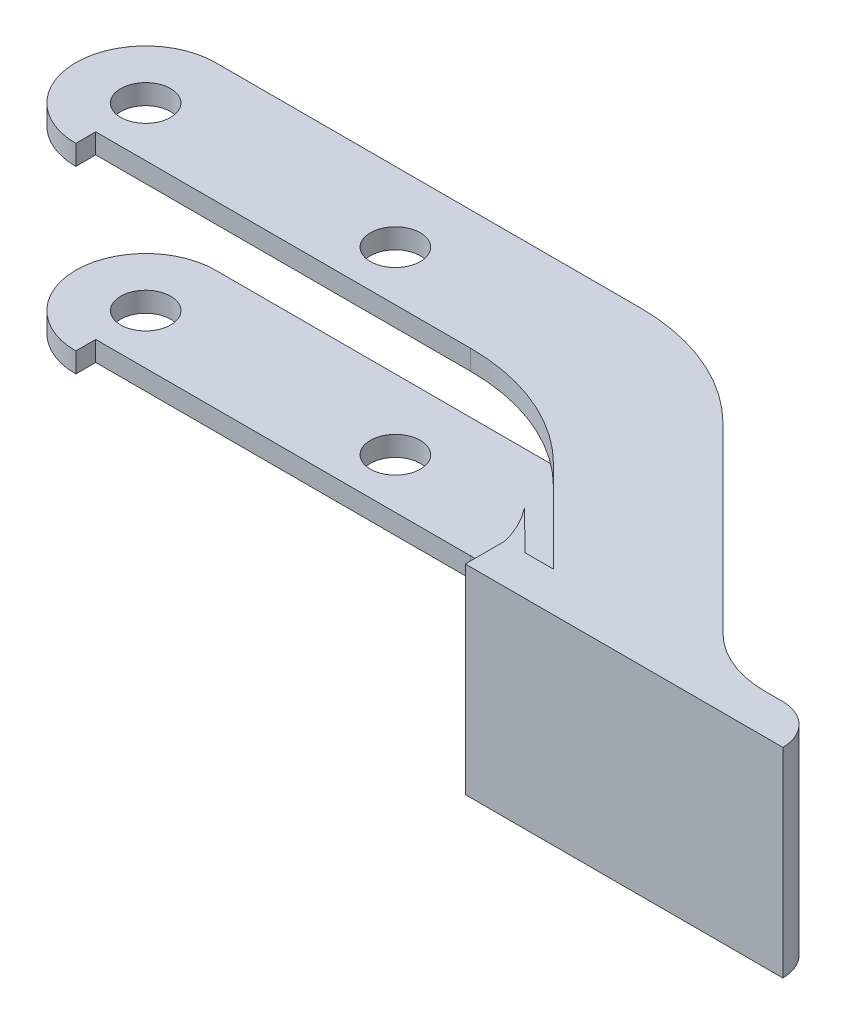
ISO-10303-21;
HEADER;
FILE_DESCRIPTION(('STEP AP214'),'2;1');
FILE_NAME('part.step','',(''),(''),'','','');
FILE_SCHEMA(('AUTOMOTIVE_DESIGN { 1 0 10303 214 1 1 1 1 }'));
ENDSEC;
DATA;
#1=APPLICATION_CONTEXT('core data for automotive mechanical design processes');
#2=APPLICATION_PROTOCOL_DEFINITION('international standard','automotive_design',2000,#1);
#3=PRODUCT_CONTEXT('',#1,'mechanical');
#4=PRODUCT('Part','Part','',(#3));
#5=PRODUCT_RELATED_PRODUCT_CATEGORY('part','',(#4));
#6=PRODUCT_DEFINITION_FORMATION('','',#4);
#7=PRODUCT_DEFINITION_CONTEXT('part definition',#1,'design');
#8=PRODUCT_DEFINITION('design','',#6,#7);
#9=PRODUCT_DEFINITION_SHAPE('','',#8);
#10=(LENGTH_UNIT() NAMED_UNIT(*) SI_UNIT(.MILLI.,.METRE.));
#11=(NAMED_UNIT(*) PLANE_ANGLE_UNIT() SI_UNIT($,.RADIAN.));
#12=(NAMED_UNIT(*) SI_UNIT($,.STERADIAN.) SOLID_ANGLE_UNIT());
#13=UNCERTAINTY_MEASURE_WITH_UNIT(LENGTH_MEASURE(1.E-05),#10,'distance_accuracy_value','');
#14=(GEOMETRIC_REPRESENTATION_CONTEXT(3) GLOBAL_UNCERTAINTY_ASSIGNED_CONTEXT((#13)) GLOBAL_UNIT_ASSIGNED_CONTEXT((#10,
#11,#12)) REPRESENTATION_CONTEXT('',''));
#15=CARTESIAN_POINT('',(0.,0.,0.));
#16=DIRECTION('',(0.,0.,1.));
#17=DIRECTION('',(1.,0.,0.));
#18=AXIS2_PLACEMENT_3D('',#15,#16,#17);
#19=CARTESIAN_POINT('',(0.,2.,0.));
#20=DIRECTION('',(0.,1.,0.));
#21=DIRECTION('',(0.,0.,1.));
#22=AXIS2_PLACEMENT_3D('',#19,#20,#21);
#23=PLANE('',#22);
#24=DIRECTION('',(0.715134595588796,0.,0.698986773975052));
#25=VECTOR('',#24,1.);
#26=CARTESIAN_POINT('',(18.3403479364555,2.,-18.7640421719382));
#27=LINE('',#26,#25);
#28=CARTESIAN_POINT('',(54.0801942687536,2.,16.1687943098556));
#29=VERTEX_POINT('',#28);
#30=CARTESIAN_POINT('',(58.0040024503266,2.,20.0040024503266));
#31=VERTEX_POINT('',#30);
#32=EDGE_CURVE('E293',#29,#31,#27,.T.);
#33=ORIENTED_EDGE('',*,*,#32,.F.);
#34=CARTESIAN_POINT('',(46.2631515841613,2.,22.4052872078923));
#35=DIRECTION('',(0.,1.,0.));
#36=DIRECTION('',(0.,0.,1.));
#37=AXIS2_PLACEMENT_3D('',#34,#35,#36);
#38=CIRCLE('',#37,10.);
#39=CARTESIAN_POINT('',(55.9705627484771,2.,20.0040024503266));
#40=VERTEX_POINT('',#39);
#41=EDGE_CURVE('E427',#29,#40,#38,.F.);
#42=ORIENTED_EDGE('',*,*,#41,.T.);
#43=DIRECTION('',(-1.,0.,0.));
#44=VECTOR('',#43,1.);
#45=CARTESIAN_POINT('',(0.,2.,20.0040024503266));
#46=LINE('',#45,#44);
#47=EDGE_CURVE('E363',#31,#40,#46,.T.);
#48=ORIENTED_EDGE('',*,*,#47,.F.);
#49=EDGE_LOOP('',(#33,#42,#48));
#50=FACE_BOUND('',#49,.T.);
#51=ADVANCED_FACE('F32',(#50),#23,.T.);
#52=CARTESIAN_POINT('',(25.,18.,0.));
#53=DIRECTION('',(0.,1.,0.));
#54=DIRECTION('',(0.,0.,-1.));
#55=AXIS2_PLACEMENT_3D('',#52,#53,#54);
#56=PLANE('',#55);
#57=CARTESIAN_POINT('',(46.2631515841613,18.,22.4052872078923));
#58=DIRECTION('',(0.,1.,0.));
#59=DIRECTION('',(0.,0.,1.));
#60=AXIS2_PLACEMENT_3D('',#57,#58,#59);
#61=CIRCLE('',#60,10.);
#62=CARTESIAN_POINT('',(55.9705627484771,18.,20.0040024503266));
#63=VERTEX_POINT('',#62);
#64=CARTESIAN_POINT('',(54.0801942687536,18.,16.1687943098556));
#65=VERTEX_POINT('',#64);
#66=EDGE_CURVE('E430',#63,#65,#61,.T.);
#67=ORIENTED_EDGE('',*,*,#66,.T.);
#68=DIRECTION('',(0.715134595588796,0.,0.698986773975052));
#69=VECTOR('',#68,1.);
#70=CARTESIAN_POINT('',(31.1257851816543,18.,-6.26730157372408));
#71=LINE('',#70,#69);
#72=CARTESIAN_POINT('',(58.0040024503266,18.,20.0040024503266));
#73=VERTEX_POINT('',#72);
#74=EDGE_CURVE('E55',#65,#73,#71,.T.);
#75=ORIENTED_EDGE('',*,*,#74,.T.);
#76=DIRECTION('',(1.,0.,0.));
#77=VECTOR('',#76,1.);
#78=CARTESIAN_POINT('',(55.9705627484771,18.,20.0040024503266));
#79=LINE('',#78,#77);
#80=EDGE_CURVE('E421',#63,#73,#79,.T.);
#81=ORIENTED_EDGE('',*,*,#80,.F.);
#82=EDGE_LOOP('',(#67,#75,#81));
#83=FACE_BOUND('',#82,.T.);
#84=ADVANCED_FACE('F487',(#83),#56,.F.);
#85=CARTESIAN_POINT('',(55.9705627484771,0.,20.0040024503266));
#86=DIRECTION('',(0.,0.,-1.));
#87=DIRECTION('',(-1.,0.,0.));
#88=AXIS2_PLACEMENT_3D('',#85,#86,#87);
#89=PLANE('',#88);
#90=CARTESIAN_POINT('',(81.9451279472808,2.,20.0040024503266));
#91=VERTEX_POINT('',#90);
#92=CARTESIAN_POINT('',(60.8324295750727,2.,20.0040024503266));
#93=VERTEX_POINT('',#92);
#94=EDGE_CURVE('E370',#91,#93,#46,.T.);
#95=ORIENTED_EDGE('',*,*,#94,.T.);
#96=DIRECTION('',(0.,-1.,0.));
#97=VECTOR('',#96,1.);
#98=CARTESIAN_POINT('',(60.8324295750727,20.,20.0040024503266));
#99=LINE('',#98,#97);
#100=CARTESIAN_POINT('',(60.8324295750727,0.,20.0040024503266));
#101=VERTEX_POINT('',#100);
#102=EDGE_CURVE('E284',#93,#101,#99,.T.);
#103=ORIENTED_EDGE('',*,*,#102,.T.);
#104=DIRECTION('',(-1.,0.,0.));
#105=VECTOR('',#104,1.);
#106=CARTESIAN_POINT('',(58.0040024503266,0.,20.0040024503266));
#107=LINE('',#106,#105);
#108=CARTESIAN_POINT('',(58.0040024503266,0.,20.0040024503266));
#109=VERTEX_POINT('',#108);
#110=EDGE_CURVE('E251',#101,#109,#107,.T.);
#111=ORIENTED_EDGE('',*,*,#110,.T.);
#112=DIRECTION('',(0.,-1.,0.));
#113=VECTOR('',#112,1.);
#114=CARTESIAN_POINT('',(58.0040024503266,20.,20.0040024503266));
#115=LINE('',#114,#113);
#116=EDGE_CURVE('E280',#31,#109,#115,.T.);
#117=ORIENTED_EDGE('',*,*,#116,.F.);
#118=ORIENTED_EDGE('',*,*,#47,.T.);
#119=DIRECTION('',(0.,1.,0.));
#120=VECTOR('',#119,1.);
#121=CARTESIAN_POINT('',(55.9705627484771,0.,20.0040024503266));
#122=LINE('',#121,#120);
#123=EDGE_CURVE('E364',#40,#63,#122,.T.);
#124=ORIENTED_EDGE('',*,*,#123,.T.);
#125=ORIENTED_EDGE('',*,*,#80,.T.);
#126=CARTESIAN_POINT('',(58.0040024503266,20.,20.0040024503266));
#127=VERTEX_POINT('',#126);
#128=EDGE_CURVE('E278',#127,#73,#115,.T.);
#129=ORIENTED_EDGE('',*,*,#128,.F.);
#130=DIRECTION('',(-1.,0.,0.));
#131=VECTOR('',#130,1.);
#132=CARTESIAN_POINT('',(58.0040024503266,20.,20.0040024503266));
#133=LINE('',#132,#131);
#134=CARTESIAN_POINT('',(60.8324295750727,20.,20.0040024503266));
#135=VERTEX_POINT('',#134);
#136=EDGE_CURVE('E258',#135,#127,#133,.T.);
#137=ORIENTED_EDGE('',*,*,#136,.F.);
#138=CARTESIAN_POINT('',(60.8324295750727,18.,20.0040024503266));
#139=VERTEX_POINT('',#138);
#140=EDGE_CURVE('E281',#135,#139,#99,.T.);
#141=ORIENTED_EDGE('',*,*,#140,.T.);
#142=CARTESIAN_POINT('',(81.9451279472808,18.,20.0040024503266));
#143=VERTEX_POINT('',#142);
#144=EDGE_CURVE('E420',#139,#143,#79,.T.);
#145=ORIENTED_EDGE('',*,*,#144,.T.);
#146=DIRECTION('',(0.,1.,0.));
#147=VECTOR('',#146,1.);
#148=CARTESIAN_POINT('',(81.9451279472808,0.,20.0040024503266));
#149=LINE('',#148,#147);
#150=CARTESIAN_POINT('',(81.9451279472808,20.,20.0040024503266));
#151=VERTEX_POINT('',#150);
#152=EDGE_CURVE('E438',#143,#151,#149,.T.);
#153=ORIENTED_EDGE('',*,*,#152,.T.);
#154=DIRECTION('',(-1.,0.,0.));
#155=VECTOR('',#154,1.);
#156=CARTESIAN_POINT('',(55.9705627484771,20.,20.0040024503266));
#157=LINE('',#156,#155);
#158=CARTESIAN_POINT('',(83.76969240085,20.,20.0040024503266));
#159=VERTEX_POINT('',#158);
#160=EDGE_CURVE('E352',#159,#151,#157,.T.);
#161=ORIENTED_EDGE('',*,*,#160,.F.);
#162=DIRECTION('',(0.,1.,0.));
#163=VECTOR('',#162,1.);
#164=CARTESIAN_POINT('',(83.76969240085,0.,20.0040024503266));
#165=LINE('',#164,#163);
#166=CARTESIAN_POINT('',(83.76969240085,0.,20.0040024503266));
#167=VERTEX_POINT('',#166);
#168=EDGE_CURVE('E457',#159,#167,#165,.F.);
#169=ORIENTED_EDGE('',*,*,#168,.T.);
#170=DIRECTION('',(-1.,0.,0.));
#171=VECTOR('',#170,1.);
#172=CARTESIAN_POINT('',(55.9705627484771,0.,20.0040024503266));
#173=LINE('',#172,#171);
#174=CARTESIAN_POINT('',(81.9451279472808,0.,20.0040024503266));
#175=VERTEX_POINT('',#174);
#176=EDGE_CURVE('E357',#167,#175,#173,.T.);
#177=ORIENTED_EDGE('',*,*,#176,.T.);
#178=DIRECTION('',(0.,1.,0.));
#179=VECTOR('',#178,1.);
#180=CARTESIAN_POINT('',(81.9451279472808,2.,20.0040024503266));
#181=LINE('',#180,#179);
#182=EDGE_CURVE('E435',#175,#91,#181,.T.);
#183=ORIENTED_EDGE('',*,*,#182,.T.);
#184=EDGE_LOOP('',(#95,#103,#111,#117,#118,#124,#125,#129,#137,#141,#145,#153,#161,#169,#177,#183));
#185=FACE_BOUND('',#184,.T.);
#186=ADVANCED_FACE('F478',(#185),#89,.T.);
#187=DIRECTION('',(0.,0.,1.));
#188=VECTOR('',#187,1.);
#189=CARTESIAN_POINT('',(0.,2.,0.));
#190=LINE('',#189,#188);
#191=CARTESIAN_POINT('',(0.,2.,5.));
#192=VERTEX_POINT('',#191);
#193=CARTESIAN_POINT('',(0.,2.,7.));
#194=VERTEX_POINT('',#193);
#195=EDGE_CURVE('E296',#192,#194,#190,.T.);
#196=ORIENTED_EDGE('',*,*,#195,.F.);
#197=DIRECTION('',(-1.,0.,0.));
#198=VECTOR('',#197,1.);
#199=CARTESIAN_POINT('',(0.,2.,4.99999999999999));
#200=LINE('',#199,#198);
#201=CARTESIAN_POINT('',(37.5441558772842,2.,4.99999999999999));
#202=VERTEX_POINT('',#201);
#203=EDGE_CURVE('E298',#202,#192,#200,.T.);
#204=ORIENTED_EDGE('',*,*,#203,.F.);
#205=CARTESIAN_POINT('',(37.5441558772843,2.,25.));
#206=DIRECTION('',(0.,1.,0.));
#207=DIRECTION('',(0.,0.,1.));
#208=AXIS2_PLACEMENT_3D('',#205,#206,#207);
#209=CIRCLE('',#208,20.);
#210=CARTESIAN_POINT('',(51.6862915010153,2.,10.8578643762691));
#211=VERTEX_POINT('',#210);
#212=EDGE_CURVE('E300',#211,#202,#209,.T.);
#213=ORIENTED_EDGE('',*,*,#212,.F.);
#214=DIRECTION('',(-0.707106781186547,0.,-0.707106781186548));
#215=VECTOR('',#214,1.);
#216=CARTESIAN_POINT('',(20.4142135623731,2.,-20.4142135623731));
#217=LINE('',#216,#215);
#218=EDGE_CURVE('E302',#93,#211,#217,.T.);
#219=ORIENTED_EDGE('',*,*,#218,.F.);
#220=ORIENTED_EDGE('',*,*,#94,.F.);
#221=CARTESIAN_POINT('',(81.9451279472808,2.,10.0040024503266));
#222=DIRECTION('',(0.,1.,0.));
#223=DIRECTION('',(0.,0.,1.));
#224=AXIS2_PLACEMENT_3D('',#221,#222,#223);
#225=CIRCLE('',#224,10.);
#226=CARTESIAN_POINT('',(74.8740601354152,2.,17.075070262192));
#227=VERTEX_POINT('',#226);
#228=EDGE_CURVE('E450',#91,#227,#225,.F.);
#229=ORIENTED_EDGE('',*,*,#228,.T.);
#230=DIRECTION('',(0.707106781186545,0.,0.70710678118655));
#231=VECTOR('',#230,1.);
#232=CARTESIAN_POINT('',(71.8700576850888,2.,14.0710678118655));
#233=LINE('',#232,#231);
#234=CARTESIAN_POINT('',(56.6568542494924,2.,-1.14213562373091));
#235=VERTEX_POINT('',#234);
#236=EDGE_CURVE('E377',#235,#227,#233,.T.);
#237=ORIENTED_EDGE('',*,*,#236,.F.);
#238=CARTESIAN_POINT('',(42.5147186257615,2.,13.));
#239=DIRECTION('',(0.,-1.,0.));
#240=DIRECTION('',(0.,0.,-1.));
#241=AXIS2_PLACEMENT_3D('',#238,#239,#240);
#242=CIRCLE('',#241,20.);
#243=CARTESIAN_POINT('',(42.5147186257614,2.,-7.));
#244=VERTEX_POINT('',#243);
#245=EDGE_CURVE('E374',#244,#235,#242,.T.);
#246=ORIENTED_EDGE('',*,*,#245,.F.);
#247=DIRECTION('',(-1.,0.,0.));
#248=VECTOR('',#247,1.);
#249=CARTESIAN_POINT('',(0.,2.,-7.));
#250=LINE('',#249,#248);
#251=CARTESIAN_POINT('',(0.,2.,-7.));
#252=VERTEX_POINT('',#251);
#253=EDGE_CURVE('E409',#244,#252,#250,.T.);
#254=ORIENTED_EDGE('',*,*,#253,.T.);
#255=CARTESIAN_POINT('',(0.,2.,0.));
#256=DIRECTION('',(0.,1.,0.));
#257=DIRECTION('',(0.,0.,1.));
#258=AXIS2_PLACEMENT_3D('',#255,#256,#257);
#259=CIRCLE('',#258,7.);
#260=EDGE_CURVE('E406',#252,#194,#259,.T.);
#261=ORIENTED_EDGE('',*,*,#260,.T.);
#262=EDGE_LOOP('',(#196,#204,#213,#219,#220,#229,#237,#246,#254,#261));
#263=FACE_BOUND('',#262,.T.);
#264=CARTESIAN_POINT('',(0.,2.,0.));
#265=DIRECTION('',(0.,1.,0.));
#266=DIRECTION('',(0.,0.,1.));
#267=AXIS2_PLACEMENT_3D('',#264,#265,#266);
#268=CIRCLE('',#267,2.5);
#269=CARTESIAN_POINT('',(0.,2.,2.5));
#270=VERTEX_POINT('',#269);
#271=EDGE_CURVE('E400',#270,#270,#268,.T.);
#272=ORIENTED_EDGE('',*,*,#271,.F.);
#273=EDGE_LOOP('',(#272));
#274=FACE_BOUND('',#273,.T.);
#275=CARTESIAN_POINT('',(25.,2.,0.));
#276=DIRECTION('',(0.,1.,0.));
#277=DIRECTION('',(0.,0.,1.));
#278=AXIS2_PLACEMENT_3D('',#275,#276,#277);
#279=CIRCLE('',#278,2.5);
#280=CARTESIAN_POINT('',(25.,2.,2.5));
#281=VERTEX_POINT('',#280);
#282=EDGE_CURVE('E394',#281,#281,#279,.T.);
#283=ORIENTED_EDGE('',*,*,#282,.F.);
#284=EDGE_LOOP('',(#283));
#285=FACE_BOUND('',#284,.T.);
#286=ADVANCED_FACE('F495',(#263,#274,#285),#23,.T.);
#287=CARTESIAN_POINT('',(0.,0.,0.));
#288=DIRECTION('',(0.,1.,0.));
#289=DIRECTION('',(0.,0.,1.));
#290=AXIS2_PLACEMENT_3D('',#287,#288,#289);
#291=PLANE('',#290);
#292=DIRECTION('',(1.,0.,0.));
#293=VECTOR('',#292,1.);
#294=CARTESIAN_POINT('',(25.,0.,4.99999999999999));
#295=LINE('',#294,#293);
#296=CARTESIAN_POINT('',(0.,0.,5.));
#297=VERTEX_POINT('',#296);
#298=CARTESIAN_POINT('',(37.5441558772842,0.,4.99999999999999));
#299=VERTEX_POINT('',#298);
#300=EDGE_CURVE('E267',#297,#299,#295,.T.);
#301=ORIENTED_EDGE('',*,*,#300,.F.);
#302=DIRECTION('',(0.,0.,-1.));
#303=VECTOR('',#302,1.);
#304=CARTESIAN_POINT('',(0.,0.,7.));
#305=LINE('',#304,#303);
#306=CARTESIAN_POINT('',(0.,0.,7.));
#307=VERTEX_POINT('',#306);
#308=EDGE_CURVE('E264',#307,#297,#305,.T.);
#309=ORIENTED_EDGE('',*,*,#308,.F.);
#310=CARTESIAN_POINT('',(0.,0.,0.));
#311=DIRECTION('',(0.,1.,0.));
#312=DIRECTION('',(0.,0.,1.));
#313=AXIS2_PLACEMENT_3D('',#310,#311,#312);
#314=CIRCLE('',#313,7.);
#315=CARTESIAN_POINT('',(0.,0.,-7.));
#316=VERTEX_POINT('',#315);
#317=EDGE_CURVE('E403',#316,#307,#314,.T.);
#318=ORIENTED_EDGE('',*,*,#317,.F.);
#319=DIRECTION('',(-1.,0.,0.));
#320=VECTOR('',#319,1.);
#321=CARTESIAN_POINT('',(0.,0.,-7.));
#322=LINE('',#321,#320);
#323=CARTESIAN_POINT('',(42.5147186257614,0.,-7.));
#324=VERTEX_POINT('',#323);
#325=EDGE_CURVE('E410',#324,#316,#322,.T.);
#326=ORIENTED_EDGE('',*,*,#325,.F.);
#327=CARTESIAN_POINT('',(42.5147186257615,0.,13.));
#328=DIRECTION('',(0.,-1.,0.));
#329=DIRECTION('',(0.,0.,-1.));
#330=AXIS2_PLACEMENT_3D('',#327,#328,#329);
#331=CIRCLE('',#330,20.);
#332=CARTESIAN_POINT('',(56.6568542494924,0.,-1.14213562373091));
#333=VERTEX_POINT('',#332);
#334=EDGE_CURVE('E373',#324,#333,#331,.T.);
#335=ORIENTED_EDGE('',*,*,#334,.T.);
#336=DIRECTION('',(0.707106781186542,0.,0.707106781186553));
#337=VECTOR('',#336,1.);
#338=CARTESIAN_POINT('',(71.8700576850888,0.,14.0710678118655));
#339=LINE('',#338,#337);
#340=CARTESIAN_POINT('',(74.8740601354152,0.,17.075070262192));
#341=VERTEX_POINT('',#340);
#342=EDGE_CURVE('E384',#333,#341,#339,.T.);
#343=ORIENTED_EDGE('',*,*,#342,.T.);
#344=CARTESIAN_POINT('',(81.9451279472808,0.,10.0040024503266));
#345=DIRECTION('',(0.,1.,0.));
#346=DIRECTION('',(0.,0.,1.));
#347=AXIS2_PLACEMENT_3D('',#344,#345,#346);
#348=CIRCLE('',#347,10.);
#349=EDGE_CURVE('E452',#341,#175,#348,.T.);
#350=ORIENTED_EDGE('',*,*,#349,.T.);
#351=ORIENTED_EDGE('',*,*,#176,.F.);
#352=CARTESIAN_POINT('',(83.76969240085,0.,24.0040024503266));
#353=DIRECTION('',(0.,1.,0.));
#354=DIRECTION('',(0.,0.,1.));
#355=AXIS2_PLACEMENT_3D('',#352,#353,#354);
#356=CIRCLE('',#355,4.);
#357=CARTESIAN_POINT('',(87.7695526217003,0.,23.9705627484772));
#358=VERTEX_POINT('',#357);
#359=EDGE_CURVE('E459',#167,#358,#356,.F.);
#360=ORIENTED_EDGE('',*,*,#359,.T.);
#361=DIRECTION('',(-1.,0.,0.));
#362=VECTOR('',#361,1.);
#363=CARTESIAN_POINT('',(61.9705627484771,0.,23.9705627484772));
#364=LINE('',#363,#362);
#365=CARTESIAN_POINT('',(55.9705627484771,0.,23.9705627484772));
#366=VERTEX_POINT('',#365);
#367=EDGE_CURVE('E378',#358,#366,#364,.T.);
#368=ORIENTED_EDGE('',*,*,#367,.T.);
#369=DIRECTION('',(0.,0.,1.));
#370=VECTOR('',#369,1.);
#371=CARTESIAN_POINT('',(55.9705627484771,0.,20.0040024503266));
#372=LINE('',#371,#370);
#373=CARTESIAN_POINT('',(55.9705627484771,0.,20.0040024503266));
#374=VERTEX_POINT('',#373);
#375=EDGE_CURVE('E354',#374,#366,#372,.T.);
#376=ORIENTED_EDGE('',*,*,#375,.F.);
#377=CARTESIAN_POINT('',(46.2631515841613,0.,22.4052872078923));
#378=DIRECTION('',(0.,1.,0.));
#379=DIRECTION('',(0.,0.,1.));
#380=AXIS2_PLACEMENT_3D('',#377,#378,#379);
#381=CIRCLE('',#380,10.);
#382=CARTESIAN_POINT('',(54.0801942687536,0.,16.1687943098556));
#383=VERTEX_POINT('',#382);
#384=EDGE_CURVE('E424',#374,#383,#381,.T.);
#385=ORIENTED_EDGE('',*,*,#384,.T.);
#386=DIRECTION('',(-0.715134595588796,0.,-0.698986773975052));
#387=VECTOR('',#386,1.);
#388=CARTESIAN_POINT('',(58.0040024503266,0.,20.0040024503266));
#389=LINE('',#388,#387);
#390=EDGE_CURVE('E47',#109,#383,#389,.T.);
#391=ORIENTED_EDGE('',*,*,#390,.F.);
#392=ORIENTED_EDGE('',*,*,#110,.F.);
#393=DIRECTION('',(0.707106781186547,0.,0.707106781186548));
#394=VECTOR('',#393,1.);
#395=CARTESIAN_POINT('',(60.8324295750727,0.,20.0040024503266));
#396=LINE('',#395,#394);
#397=CARTESIAN_POINT('',(51.6862915010153,0.,10.8578643762691));
#398=VERTEX_POINT('',#397);
#399=EDGE_CURVE('E273',#398,#101,#396,.T.);
#400=ORIENTED_EDGE('',*,*,#399,.F.);
#401=CARTESIAN_POINT('',(37.5441558772843,0.,25.));
#402=DIRECTION('',(0.,-1.,0.));
#403=DIRECTION('',(0.,0.,1.));
#404=AXIS2_PLACEMENT_3D('',#401,#402,#403);
#405=CIRCLE('',#404,20.);
#406=EDGE_CURVE('E270',#299,#398,#405,.T.);
#407=ORIENTED_EDGE('',*,*,#406,.F.);
#408=EDGE_LOOP('',(#301,#309,#318,#326,#335,#343,#350,#351,#360,#368,#376,#385,#391,#392,#400,#407));
#409=FACE_BOUND('',#408,.T.);
#410=CARTESIAN_POINT('',(0.,0.,0.));
#411=DIRECTION('',(0.,1.,0.));
#412=DIRECTION('',(0.,0.,1.));
#413=AXIS2_PLACEMENT_3D('',#410,#411,#412);
#414=CIRCLE('',#413,2.5);
#415=CARTESIAN_POINT('',(0.,0.,2.5));
#416=VERTEX_POINT('',#415);
#417=EDGE_CURVE('E397',#416,#416,#414,.T.);
#418=ORIENTED_EDGE('',*,*,#417,.T.);
#419=EDGE_LOOP('',(#418));
#420=FACE_BOUND('',#419,.T.);
#421=CARTESIAN_POINT('',(25.,0.,0.));
#422=DIRECTION('',(0.,1.,0.));
#423=DIRECTION('',(0.,0.,1.));
#424=AXIS2_PLACEMENT_3D('',#421,#422,#423);
#425=CIRCLE('',#424,2.5);
#426=CARTESIAN_POINT('',(25.,0.,2.5));
#427=VERTEX_POINT('',#426);
#428=EDGE_CURVE('E391',#427,#427,#425,.T.);
#429=ORIENTED_EDGE('',*,*,#428,.T.);
#430=EDGE_LOOP('',(#429));
#431=FACE_BOUND('',#430,.T.);
#432=ADVANCED_FACE('F549',(#409,#420,#431),#291,.F.);
#433=CARTESIAN_POINT('',(0.,2.,0.));
#434=DIRECTION('',(0.,-1.,0.));
#435=DIRECTION('',(0.,0.,-1.));
#436=AXIS2_PLACEMENT_3D('',#433,#434,#435);
#437=CYLINDRICAL_SURFACE('',#436,7.);
#438=ORIENTED_EDGE('',*,*,#317,.T.);
#439=DIRECTION('',(0.,-1.,0.));
#440=VECTOR('',#439,1.);
#441=CARTESIAN_POINT('',(0.,2.,7.));
#442=LINE('',#441,#440);
#443=EDGE_CURVE('E418',#194,#307,#442,.T.);
#444=ORIENTED_EDGE('',*,*,#443,.F.);
#445=ORIENTED_EDGE('',*,*,#260,.F.);
#446=DIRECTION('',(0.,-1.,0.));
#447=VECTOR('',#446,1.);
#448=CARTESIAN_POINT('',(0.,2.,-7.));
#449=LINE('',#448,#447);
#450=EDGE_CURVE('E412',#252,#316,#449,.T.);
#451=ORIENTED_EDGE('',*,*,#450,.T.);
#452=EDGE_LOOP('',(#438,#444,#445,#451));
#453=FACE_BOUND('',#452,.T.);
#454=ADVANCED_FACE('F553',(#453),#437,.T.);
#455=CARTESIAN_POINT('',(0.,2.,-7.));
#456=DIRECTION('',(0.,0.,1.));
#457=DIRECTION('',(1.,0.,0.));
#458=AXIS2_PLACEMENT_3D('',#455,#456,#457);
#459=PLANE('',#458);
#460=ORIENTED_EDGE('',*,*,#325,.T.);
#461=ORIENTED_EDGE('',*,*,#450,.F.);
#462=ORIENTED_EDGE('',*,*,#253,.F.);
#463=DIRECTION('',(0.,-1.,0.));
#464=VECTOR('',#463,1.);
#465=CARTESIAN_POINT('',(42.5147186257614,2.,-7.));
#466=LINE('',#465,#464);
#467=EDGE_CURVE('E381',#244,#324,#466,.T.);
#468=ORIENTED_EDGE('',*,*,#467,.T.);
#469=EDGE_LOOP('',(#460,#461,#462,#468));
#470=FACE_BOUND('',#469,.T.);
#471=ADVANCED_FACE('F545',(#470),#459,.F.);
#472=CARTESIAN_POINT('',(0.,2.,0.));
#473=DIRECTION('',(0.,-1.,0.));
#474=DIRECTION('',(0.,0.,-1.));
#475=AXIS2_PLACEMENT_3D('',#472,#473,#474);
#476=CYLINDRICAL_SURFACE('',#475,2.5);
#477=ORIENTED_EDGE('',*,*,#271,.T.);
#478=EDGE_LOOP('',(#477));
#479=FACE_BOUND('',#478,.T.);
#480=ORIENTED_EDGE('',*,*,#417,.F.);
#481=EDGE_LOOP('',(#480));
#482=FACE_BOUND('',#481,.T.);
#483=ADVANCED_FACE('F542',(#479,#482),#476,.F.);
#484=CARTESIAN_POINT('',(25.,2.,0.));
#485=DIRECTION('',(0.,-1.,0.));
#486=DIRECTION('',(0.,0.,-1.));
#487=AXIS2_PLACEMENT_3D('',#484,#485,#486);
#488=CYLINDRICAL_SURFACE('',#487,2.5);
#489=ORIENTED_EDGE('',*,*,#282,.T.);
#490=EDGE_LOOP('',(#489));
#491=FACE_BOUND('',#490,.T.);
#492=ORIENTED_EDGE('',*,*,#428,.F.);
#493=EDGE_LOOP('',(#492));
#494=FACE_BOUND('',#493,.T.);
#495=ADVANCED_FACE('F533',(#491,#494),#488,.F.);
#496=CARTESIAN_POINT('',(61.9705627484771,2.,23.9705627484772));
#497=DIRECTION('',(0.,0.,1.));
#498=DIRECTION('',(1.,0.,0.));
#499=AXIS2_PLACEMENT_3D('',#496,#497,#498);
#500=PLANE('',#499);
#501=DIRECTION('',(0.,1.,0.));
#502=VECTOR('',#501,1.);
#503=CARTESIAN_POINT('',(87.7695526217003,0.,23.9705627484772));
#504=LINE('',#503,#502);
#505=CARTESIAN_POINT('',(87.7695526217003,20.,23.9705627484772));
#506=VERTEX_POINT('',#505);
#507=EDGE_CURVE('E366',#358,#506,#504,.T.);
#508=ORIENTED_EDGE('',*,*,#507,.T.);
#509=DIRECTION('',(1.,0.,0.));
#510=VECTOR('',#509,1.);
#511=CARTESIAN_POINT('',(55.9705627484771,20.,23.9705627484772));
#512=LINE('',#511,#510);
#513=CARTESIAN_POINT('',(55.9705627484771,20.,23.9705627484772));
#514=VERTEX_POINT('',#513);
#515=EDGE_CURVE('E349',#514,#506,#512,.T.);
#516=ORIENTED_EDGE('',*,*,#515,.F.);
#517=DIRECTION('',(0.,1.,0.));
#518=VECTOR('',#517,1.);
#519=CARTESIAN_POINT('',(55.9705627484771,0.,23.9705627484772));
#520=LINE('',#519,#518);
#521=EDGE_CURVE('E359',#366,#514,#520,.T.);
#522=ORIENTED_EDGE('',*,*,#521,.F.);
#523=ORIENTED_EDGE('',*,*,#367,.F.);
#524=EDGE_LOOP('',(#508,#516,#522,#523));
#525=FACE_BOUND('',#524,.T.);
#526=ADVANCED_FACE('F529',(#525),#500,.T.);
#527=CARTESIAN_POINT('',(71.8700576850888,2.,14.0710678118655));
#528=DIRECTION('',(0.707106781186553,0.,-0.707106781186542));
#529=DIRECTION('',(-0.707106781186542,0.,-0.707106781186553));
#530=AXIS2_PLACEMENT_3D('',#527,#528,#529);
#531=PLANE('',#530);
#532=ORIENTED_EDGE('',*,*,#236,.T.);
#533=DIRECTION('',(0.,1.,0.));
#534=VECTOR('',#533,1.);
#535=CARTESIAN_POINT('',(74.8740601354152,0.,17.075070262192));
#536=LINE('',#535,#534);
#537=EDGE_CURVE('E443',#227,#341,#536,.F.);
#538=ORIENTED_EDGE('',*,*,#537,.T.);
#539=ORIENTED_EDGE('',*,*,#342,.F.);
#540=DIRECTION('',(0.,-1.,0.));
#541=VECTOR('',#540,1.);
#542=CARTESIAN_POINT('',(56.6568542494924,2.,-1.14213562373091));
#543=LINE('',#542,#541);
#544=EDGE_CURVE('E388',#235,#333,#543,.T.);
#545=ORIENTED_EDGE('',*,*,#544,.F.);
#546=EDGE_LOOP('',(#532,#538,#539,#545));
#547=FACE_BOUND('',#546,.T.);
#548=ADVANCED_FACE('F532',(#547),#531,.T.);
#549=CARTESIAN_POINT('',(42.5147186257615,2.,13.));
#550=DIRECTION('',(0.,-1.,0.));
#551=DIRECTION('',(0.,0.,-1.));
#552=AXIS2_PLACEMENT_3D('',#549,#550,#551);
#553=CYLINDRICAL_SURFACE('',#552,20.);
#554=ORIENTED_EDGE('',*,*,#334,.F.);
#555=ORIENTED_EDGE('',*,*,#467,.F.);
#556=ORIENTED_EDGE('',*,*,#245,.T.);
#557=ORIENTED_EDGE('',*,*,#544,.T.);
#558=EDGE_LOOP('',(#554,#555,#556,#557));
#559=FACE_BOUND('',#558,.T.);
#560=ADVANCED_FACE('F527',(#559),#553,.T.);
#561=CARTESIAN_POINT('',(55.9705627484771,0.,20.0040024503266));
#562=DIRECTION('',(-1.,0.,0.));
#563=DIRECTION('',(0.,0.,1.));
#564=AXIS2_PLACEMENT_3D('',#561,#562,#563);
#565=PLANE('',#564);
#566=ORIENTED_EDGE('',*,*,#521,.T.);
#567=DIRECTION('',(0.,0.,1.));
#568=VECTOR('',#567,1.);
#569=CARTESIAN_POINT('',(55.9705627484771,20.,20.0040024503266));
#570=LINE('',#569,#568);
#571=CARTESIAN_POINT('',(55.9705627484771,20.,20.0040024503266));
#572=VERTEX_POINT('',#571);
#573=EDGE_CURVE('E344',#572,#514,#570,.T.);
#574=ORIENTED_EDGE('',*,*,#573,.F.);
#575=EDGE_CURVE('E365',#63,#572,#122,.T.);
#576=ORIENTED_EDGE('',*,*,#575,.F.);
#577=ORIENTED_EDGE('',*,*,#123,.F.);
#578=EDGE_CURVE('E360',#374,#40,#122,.T.);
#579=ORIENTED_EDGE('',*,*,#578,.F.);
#580=ORIENTED_EDGE('',*,*,#375,.T.);
#581=EDGE_LOOP('',(#566,#574,#576,#577,#579,#580));
#582=FACE_BOUND('',#581,.T.);
#583=ADVANCED_FACE('F523',(#582),#565,.T.);
#584=CARTESIAN_POINT('',(0.,20.,0.));
#585=DIRECTION('',(0.,1.,0.));
#586=DIRECTION('',(0.,0.,1.));
#587=AXIS2_PLACEMENT_3D('',#584,#585,#586);
#588=PLANE('',#587);
#589=DIRECTION('',(0.,0.,-1.));
#590=VECTOR('',#589,1.);
#591=CARTESIAN_POINT('',(0.,20.,7.));
#592=LINE('',#591,#590);
#593=CARTESIAN_POINT('',(0.,20.,7.));
#594=VERTEX_POINT('',#593);
#595=CARTESIAN_POINT('',(0.,20.,5.));
#596=VERTEX_POINT('',#595);
#597=EDGE_CURVE('E226',#594,#596,#592,.T.);
#598=ORIENTED_EDGE('',*,*,#597,.T.);
#599=DIRECTION('',(1.,0.,0.));
#600=VECTOR('',#599,1.);
#601=CARTESIAN_POINT('',(0.,20.,5.));
#602=LINE('',#601,#600);
#603=CARTESIAN_POINT('',(37.5441558772842,20.,4.99999999999999));
#604=VERTEX_POINT('',#603);
#605=EDGE_CURVE('E236',#596,#604,#602,.T.);
#606=ORIENTED_EDGE('',*,*,#605,.T.);
#607=CARTESIAN_POINT('',(37.5441558772843,20.,25.));
#608=DIRECTION('',(0.,-1.,0.));
#609=DIRECTION('',(0.,0.,1.));
#610=AXIS2_PLACEMENT_3D('',#607,#608,#609);
#611=CIRCLE('',#610,20.);
#612=CARTESIAN_POINT('',(51.6862915010153,20.,10.8578643762691));
#613=VERTEX_POINT('',#612);
#614=EDGE_CURVE('E243',#604,#613,#611,.T.);
#615=ORIENTED_EDGE('',*,*,#614,.T.);
#616=DIRECTION('',(0.707106781186547,0.,0.707106781186548));
#617=VECTOR('',#616,1.);
#618=CARTESIAN_POINT('',(60.8324295750727,20.,20.0040024503266));
#619=LINE('',#618,#617);
#620=EDGE_CURVE('E255',#613,#135,#619,.T.);
#621=ORIENTED_EDGE('',*,*,#620,.T.);
#622=ORIENTED_EDGE('',*,*,#136,.T.);
#623=DIRECTION('',(-0.715134595588796,0.,-0.698986773975052));
#624=VECTOR('',#623,1.);
#625=CARTESIAN_POINT('',(58.0040024503266,20.,20.0040024503266));
#626=LINE('',#625,#624);
#627=CARTESIAN_POINT('',(54.0801942687536,20.,16.1687943098556));
#628=VERTEX_POINT('',#627);
#629=EDGE_CURVE('E261',#127,#628,#626,.T.);
#630=ORIENTED_EDGE('',*,*,#629,.T.);
#631=CARTESIAN_POINT('',(46.2631515841613,20.,22.4052872078923));
#632=DIRECTION('',(0.,1.,0.));
#633=DIRECTION('',(0.,0.,1.));
#634=AXIS2_PLACEMENT_3D('',#631,#632,#633);
#635=CIRCLE('',#634,10.);
#636=EDGE_CURVE('E433',#628,#572,#635,.F.);
#637=ORIENTED_EDGE('',*,*,#636,.T.);
#638=ORIENTED_EDGE('',*,*,#573,.T.);
#639=ORIENTED_EDGE('',*,*,#515,.T.);
#640=CARTESIAN_POINT('',(83.76969240085,20.,24.0040024503266));
#641=DIRECTION('',(0.,1.,0.));
#642=DIRECTION('',(0.,0.,1.));
#643=AXIS2_PLACEMENT_3D('',#640,#641,#642);
#644=CIRCLE('',#643,4.);
#645=EDGE_CURVE('E455',#506,#159,#644,.T.);
#646=ORIENTED_EDGE('',*,*,#645,.T.);
#647=ORIENTED_EDGE('',*,*,#160,.T.);
#648=CARTESIAN_POINT('',(81.9451279472808,20.,10.0040024503266));
#649=DIRECTION('',(0.,1.,0.));
#650=DIRECTION('',(0.,0.,1.));
#651=AXIS2_PLACEMENT_3D('',#648,#649,#650);
#652=CIRCLE('',#651,10.);
#653=CARTESIAN_POINT('',(74.8740601354153,20.,17.075070262192));
#654=VERTEX_POINT('',#653);
#655=EDGE_CURVE('E445',#151,#654,#652,.F.);
#656=ORIENTED_EDGE('',*,*,#655,.T.);
#657=DIRECTION('',(0.707106781186545,0.,0.70710678118655));
#658=VECTOR('',#657,1.);
#659=CARTESIAN_POINT('',(71.8700576850888,20.,14.0710678118655));
#660=LINE('',#659,#658);
#661=CARTESIAN_POINT('',(56.6568542494924,20.,-1.14213562373091));
#662=VERTEX_POINT('',#661);
#663=EDGE_CURVE('E323',#662,#654,#660,.T.);
#664=ORIENTED_EDGE('',*,*,#663,.F.);
#665=CARTESIAN_POINT('',(42.5147186257615,20.,13.));
#666=DIRECTION('',(0.,-1.,0.));
#667=DIRECTION('',(0.,0.,-1.));
#668=AXIS2_PLACEMENT_3D('',#665,#666,#667);
#669=CIRCLE('',#668,20.);
#670=CARTESIAN_POINT('',(42.5147186257614,20.,-7.));
#671=VERTEX_POINT('',#670);
#672=EDGE_CURVE('E338',#671,#662,#669,.T.);
#673=ORIENTED_EDGE('',*,*,#672,.F.);
#674=DIRECTION('',(1.,0.,0.));
#675=VECTOR('',#674,1.);
#676=CARTESIAN_POINT('',(42.5147186257615,20.,-7.));
#677=LINE('',#676,#675);
#678=CARTESIAN_POINT('',(0.,20.,-7.));
#679=VERTEX_POINT('',#678);
#680=EDGE_CURVE('E330',#679,#671,#677,.T.);
#681=ORIENTED_EDGE('',*,*,#680,.F.);
#682=CARTESIAN_POINT('',(0.,20.,0.));
#683=DIRECTION('',(0.,1.,0.));
#684=DIRECTION('',(0.,0.,1.));
#685=AXIS2_PLACEMENT_3D('',#682,#683,#684);
#686=CIRCLE('',#685,7.);
#687=EDGE_CURVE('E249',#679,#594,#686,.T.);
#688=ORIENTED_EDGE('',*,*,#687,.T.);
#689=EDGE_LOOP('',(#598,#606,#615,#621,#622,#630,#637,#638,#639,#646,#647,#656,#664,#673,#681,#688));
#690=FACE_BOUND('',#689,.T.);
#691=CARTESIAN_POINT('',(25.,20.,0.));
#692=DIRECTION('',(0.,1.,0.));
#693=DIRECTION('',(0.,0.,1.));
#694=AXIS2_PLACEMENT_3D('',#691,#692,#693);
#695=CIRCLE('',#694,2.5);
#696=CARTESIAN_POINT('',(25.,20.,2.5));
#697=VERTEX_POINT('',#696);
#698=EDGE_CURVE('E304',#697,#697,#695,.T.);
#699=ORIENTED_EDGE('',*,*,#698,.F.);
#700=EDGE_LOOP('',(#699));
#701=FACE_BOUND('',#700,.T.);
#702=CARTESIAN_POINT('',(0.,20.,0.));
#703=DIRECTION('',(0.,1.,0.));
#704=DIRECTION('',(0.,0.,1.));
#705=AXIS2_PLACEMENT_3D('',#702,#703,#704);
#706=CIRCLE('',#705,2.5);
#707=CARTESIAN_POINT('',(0.,20.,2.5));
#708=VERTEX_POINT('',#707);
#709=EDGE_CURVE('E308',#708,#708,#706,.T.);
#710=ORIENTED_EDGE('',*,*,#709,.F.);
#711=EDGE_LOOP('',(#710));
#712=FACE_BOUND('',#711,.T.);
#713=ADVANCED_FACE('F246',(#690,#701,#712),#588,.T.);
#714=CARTESIAN_POINT('',(42.5147186257615,18.,-7.));
#715=DIRECTION('',(0.,0.,1.));
#716=DIRECTION('',(1.,0.,0.));
#717=AXIS2_PLACEMENT_3D('',#714,#715,#716);
#718=PLANE('',#717);
#719=ORIENTED_EDGE('',*,*,#680,.T.);
#720=DIRECTION('',(0.,1.,0.));
#721=VECTOR('',#720,1.);
#722=CARTESIAN_POINT('',(42.5147186257614,18.,-7.));
#723=LINE('',#722,#721);
#724=CARTESIAN_POINT('',(42.5147186257614,18.,-7.));
#725=VERTEX_POINT('',#724);
#726=EDGE_CURVE('E341',#725,#671,#723,.T.);
#727=ORIENTED_EDGE('',*,*,#726,.F.);
#728=DIRECTION('',(1.,0.,0.));
#729=VECTOR('',#728,1.);
#730=CARTESIAN_POINT('',(42.5147186257615,18.,-7.));
#731=LINE('',#730,#729);
#732=CARTESIAN_POINT('',(0.,18.,-7.));
#733=VERTEX_POINT('',#732);
#734=EDGE_CURVE('E333',#733,#725,#731,.T.);
#735=ORIENTED_EDGE('',*,*,#734,.F.);
#736=DIRECTION('',(0.,1.,0.));
#737=VECTOR('',#736,1.);
#738=CARTESIAN_POINT('',(0.,18.,-7.));
#739=LINE('',#738,#737);
#740=EDGE_CURVE('E319',#733,#679,#739,.T.);
#741=ORIENTED_EDGE('',*,*,#740,.T.);
#742=EDGE_LOOP('',(#719,#727,#735,#741));
#743=FACE_BOUND('',#742,.T.);
#744=ADVANCED_FACE('F519',(#743),#718,.F.);
#745=CARTESIAN_POINT('',(42.5147186257615,18.,13.));
#746=DIRECTION('',(0.,1.,0.));
#747=DIRECTION('',(0.,0.,1.));
#748=AXIS2_PLACEMENT_3D('',#745,#746,#747);
#749=CYLINDRICAL_SURFACE('',#748,20.);
#750=ORIENTED_EDGE('',*,*,#672,.T.);
#751=DIRECTION('',(0.,1.,0.));
#752=VECTOR('',#751,1.);
#753=CARTESIAN_POINT('',(56.6568542494924,18.,-1.14213562373091));
#754=LINE('',#753,#752);
#755=CARTESIAN_POINT('',(56.6568542494924,18.,-1.14213562373091));
#756=VERTEX_POINT('',#755);
#757=EDGE_CURVE('E335',#756,#662,#754,.T.);
#758=ORIENTED_EDGE('',*,*,#757,.F.);
#759=CARTESIAN_POINT('',(42.5147186257615,18.,13.));
#760=DIRECTION('',(0.,-1.,0.));
#761=DIRECTION('',(0.,0.,-1.));
#762=AXIS2_PLACEMENT_3D('',#759,#760,#761);
#763=CIRCLE('',#762,20.);
#764=EDGE_CURVE('E329',#725,#756,#763,.T.);
#765=ORIENTED_EDGE('',*,*,#764,.F.);
#766=ORIENTED_EDGE('',*,*,#726,.T.);
#767=EDGE_LOOP('',(#750,#758,#765,#766));
#768=FACE_BOUND('',#767,.T.);
#769=ADVANCED_FACE('F511',(#768),#749,.T.);
#770=CARTESIAN_POINT('',(71.8700576850888,18.,14.0710678118655));
#771=DIRECTION('',(-0.70710678118655,0.,0.707106781186545));
#772=DIRECTION('',(0.707106781186545,0.,0.70710678118655));
#773=AXIS2_PLACEMENT_3D('',#770,#771,#772);
#774=PLANE('',#773);
#775=ORIENTED_EDGE('',*,*,#663,.T.);
#776=DIRECTION('',(0.,1.,0.));
#777=VECTOR('',#776,1.);
#778=CARTESIAN_POINT('',(74.8740601354153,18.,17.075070262192));
#779=LINE('',#778,#777);
#780=CARTESIAN_POINT('',(74.8740601354153,18.,17.075070262192));
#781=VERTEX_POINT('',#780);
#782=EDGE_CURVE('E441',#654,#781,#779,.F.);
#783=ORIENTED_EDGE('',*,*,#782,.T.);
#784=DIRECTION('',(0.707106781186542,0.,0.707106781186553));
#785=VECTOR('',#784,1.);
#786=CARTESIAN_POINT('',(71.8700576850888,18.,14.0710678118655));
#787=LINE('',#786,#785);
#788=EDGE_CURVE('E326',#756,#781,#787,.T.);
#789=ORIENTED_EDGE('',*,*,#788,.F.);
#790=ORIENTED_EDGE('',*,*,#757,.T.);
#791=EDGE_LOOP('',(#775,#783,#789,#790));
#792=FACE_BOUND('',#791,.T.);
#793=ADVANCED_FACE('F503',(#792),#774,.F.);
#794=DIRECTION('',(-1.,0.,0.));
#795=VECTOR('',#794,1.);
#796=CARTESIAN_POINT('',(25.,18.,4.99999999999999));
#797=LINE('',#796,#795);
#798=CARTESIAN_POINT('',(37.5441558772842,18.,4.99999999999999));
#799=VERTEX_POINT('',#798);
#800=CARTESIAN_POINT('',(0.,18.,5.));
#801=VERTEX_POINT('',#800);
#802=EDGE_CURVE('E463',#799,#801,#797,.T.);
#803=ORIENTED_EDGE('',*,*,#802,.T.);
#804=DIRECTION('',(0.,0.,1.));
#805=VECTOR('',#804,1.);
#806=CARTESIAN_POINT('',(0.,18.,-3.13158659643444E-13));
#807=LINE('',#806,#805);
#808=CARTESIAN_POINT('',(0.,18.,7.));
#809=VERTEX_POINT('',#808);
#810=EDGE_CURVE('E229',#801,#809,#807,.T.);
#811=ORIENTED_EDGE('',*,*,#810,.T.);
#812=CARTESIAN_POINT('',(0.,18.,0.));
#813=DIRECTION('',(0.,1.,0.));
#814=DIRECTION('',(0.,0.,1.));
#815=AXIS2_PLACEMENT_3D('',#812,#813,#814);
#816=CIRCLE('',#815,7.);
#817=EDGE_CURVE('E316',#733,#809,#816,.T.);
#818=ORIENTED_EDGE('',*,*,#817,.F.);
#819=ORIENTED_EDGE('',*,*,#734,.T.);
#820=ORIENTED_EDGE('',*,*,#764,.T.);
#821=ORIENTED_EDGE('',*,*,#788,.T.);
#822=CARTESIAN_POINT('',(81.9451279472808,18.,10.0040024503266));
#823=DIRECTION('',(0.,1.,0.));
#824=DIRECTION('',(0.,0.,1.));
#825=AXIS2_PLACEMENT_3D('',#822,#823,#824);
#826=CIRCLE('',#825,10.);
#827=EDGE_CURVE('E447',#781,#143,#826,.T.);
#828=ORIENTED_EDGE('',*,*,#827,.T.);
#829=ORIENTED_EDGE('',*,*,#144,.F.);
#830=DIRECTION('',(-0.707106781186547,0.,-0.707106781186548));
#831=VECTOR('',#830,1.);
#832=CARTESIAN_POINT('',(32.9142135623731,18.,-7.91421356237308));
#833=LINE('',#832,#831);
#834=CARTESIAN_POINT('',(51.6862915010153,18.,10.8578643762691));
#835=VERTEX_POINT('',#834);
#836=EDGE_CURVE('E11',#139,#835,#833,.T.);
#837=ORIENTED_EDGE('',*,*,#836,.T.);
#838=CARTESIAN_POINT('',(37.5441558772843,18.,25.));
#839=DIRECTION('',(0.,1.,0.));
#840=DIRECTION('',(0.,0.,1.));
#841=AXIS2_PLACEMENT_3D('',#838,#839,#840);
#842=CIRCLE('',#841,20.);
#843=EDGE_CURVE('E40',#835,#799,#842,.T.);
#844=ORIENTED_EDGE('',*,*,#843,.T.);
#845=EDGE_LOOP('',(#803,#811,#818,#819,#820,#821,#828,#829,#837,#844));
#846=FACE_BOUND('',#845,.T.);
#847=CARTESIAN_POINT('',(25.,18.,0.));
#848=DIRECTION('',(0.,1.,0.));
#849=DIRECTION('',(0.,0.,1.));
#850=AXIS2_PLACEMENT_3D('',#847,#848,#849);
#851=CIRCLE('',#850,2.5);
#852=CARTESIAN_POINT('',(25.,18.,2.5));
#853=VERTEX_POINT('',#852);
#854=EDGE_CURVE('E305',#853,#853,#851,.T.);
#855=ORIENTED_EDGE('',*,*,#854,.T.);
#856=EDGE_LOOP('',(#855));
#857=FACE_BOUND('',#856,.T.);
#858=CARTESIAN_POINT('',(0.,18.,0.));
#859=DIRECTION('',(0.,1.,0.));
#860=DIRECTION('',(0.,0.,1.));
#861=AXIS2_PLACEMENT_3D('',#858,#859,#860);
#862=CIRCLE('',#861,2.5);
#863=CARTESIAN_POINT('',(0.,18.,2.5));
#864=VERTEX_POINT('',#863);
#865=EDGE_CURVE('E311',#864,#864,#862,.T.);
#866=ORIENTED_EDGE('',*,*,#865,.T.);
#867=EDGE_LOOP('',(#866));
#868=FACE_BOUND('',#867,.T.);
#869=ADVANCED_FACE('F466',(#846,#857,#868),#56,.F.);
#870=CARTESIAN_POINT('',(0.,18.,0.));
#871=DIRECTION('',(0.,1.,0.));
#872=DIRECTION('',(0.,0.,1.));
#873=AXIS2_PLACEMENT_3D('',#870,#871,#872);
#874=CYLINDRICAL_SURFACE('',#873,7.);
#875=ORIENTED_EDGE('',*,*,#687,.F.);
#876=ORIENTED_EDGE('',*,*,#740,.F.);
#877=ORIENTED_EDGE('',*,*,#817,.T.);
#878=DIRECTION('',(0.,1.,0.));
#879=VECTOR('',#878,1.);
#880=CARTESIAN_POINT('',(0.,18.,7.));
#881=LINE('',#880,#879);
#882=EDGE_CURVE('E321',#809,#594,#881,.T.);
#883=ORIENTED_EDGE('',*,*,#882,.T.);
#884=EDGE_LOOP('',(#875,#876,#877,#883));
#885=FACE_BOUND('',#884,.T.);
#886=ADVANCED_FACE('F502',(#885),#874,.T.);
#887=CARTESIAN_POINT('',(0.,18.,0.));
#888=DIRECTION('',(0.,1.,0.));
#889=DIRECTION('',(0.,0.,1.));
#890=AXIS2_PLACEMENT_3D('',#887,#888,#889);
#891=CYLINDRICAL_SURFACE('',#890,2.5);
#892=ORIENTED_EDGE('',*,*,#865,.F.);
#893=EDGE_LOOP('',(#892));
#894=FACE_BOUND('',#893,.T.);
#895=ORIENTED_EDGE('',*,*,#709,.T.);
#896=EDGE_LOOP('',(#895));
#897=FACE_BOUND('',#896,.T.);
#898=ADVANCED_FACE('F508',(#894,#897),#891,.F.);
#899=CARTESIAN_POINT('',(25.,18.,0.));
#900=DIRECTION('',(0.,1.,0.));
#901=DIRECTION('',(0.,0.,1.));
#902=AXIS2_PLACEMENT_3D('',#899,#900,#901);
#903=CYLINDRICAL_SURFACE('',#902,2.5);
#904=ORIENTED_EDGE('',*,*,#854,.F.);
#905=EDGE_LOOP('',(#904));
#906=FACE_BOUND('',#905,.T.);
#907=ORIENTED_EDGE('',*,*,#698,.T.);
#908=EDGE_LOOP('',(#907));
#909=FACE_BOUND('',#908,.T.);
#910=ADVANCED_FACE('F564',(#906,#909),#903,.F.);
#911=CARTESIAN_POINT('',(46.2631515841613,0.,22.4052872078923));
#912=DIRECTION('',(0.,1.,0.));
#913=DIRECTION('',(0.,0.,1.));
#914=AXIS2_PLACEMENT_3D('',#911,#912,#913);
#915=CYLINDRICAL_SURFACE('',#914,10.);
#916=ORIENTED_EDGE('',*,*,#41,.F.);
#917=DIRECTION('',(0.,1.,0.));
#918=VECTOR('',#917,1.);
#919=CARTESIAN_POINT('',(54.0801942687536,0.,16.1687943098556));
#920=LINE('',#919,#918);
#921=EDGE_CURVE('E291',#29,#383,#920,.F.);
#922=ORIENTED_EDGE('',*,*,#921,.T.);
#923=ORIENTED_EDGE('',*,*,#384,.F.);
#924=ORIENTED_EDGE('',*,*,#578,.T.);
#925=EDGE_LOOP('',(#916,#922,#923,#924));
#926=FACE_BOUND('',#925,.T.);
#927=ADVANCED_FACE('F561',(#926),#915,.F.);
#928=CARTESIAN_POINT('',(46.2631515841613,0.,22.4052872078923));
#929=DIRECTION('',(0.,1.,0.));
#930=DIRECTION('',(0.,0.,1.));
#931=AXIS2_PLACEMENT_3D('',#928,#929,#930);
#932=CYLINDRICAL_SURFACE('',#931,10.);
#933=ORIENTED_EDGE('',*,*,#636,.F.);
#934=DIRECTION('',(0.,1.,0.));
#935=VECTOR('',#934,1.);
#936=CARTESIAN_POINT('',(54.0801942687536,0.,16.1687943098556));
#937=LINE('',#936,#935);
#938=EDGE_CURVE('E461',#628,#65,#937,.F.);
#939=ORIENTED_EDGE('',*,*,#938,.T.);
#940=ORIENTED_EDGE('',*,*,#66,.F.);
#941=ORIENTED_EDGE('',*,*,#575,.T.);
#942=EDGE_LOOP('',(#933,#939,#940,#941));
#943=FACE_BOUND('',#942,.T.);
#944=ADVANCED_FACE('F483',(#943),#932,.F.);
#945=CARTESIAN_POINT('',(81.9451279472808,0.,10.0040024503266));
#946=DIRECTION('',(0.,1.,0.));
#947=DIRECTION('',(0.,0.,1.));
#948=AXIS2_PLACEMENT_3D('',#945,#946,#947);
#949=CYLINDRICAL_SURFACE('',#948,10.);
#950=ORIENTED_EDGE('',*,*,#827,.F.);
#951=ORIENTED_EDGE('',*,*,#782,.F.);
#952=ORIENTED_EDGE('',*,*,#655,.F.);
#953=ORIENTED_EDGE('',*,*,#152,.F.);
#954=EDGE_LOOP('',(#950,#951,#952,#953));
#955=FACE_BOUND('',#954,.T.);
#956=ADVANCED_FACE('F568',(#955),#949,.F.);
#957=CARTESIAN_POINT('',(81.9451279472808,0.,10.0040024503266));
#958=DIRECTION('',(0.,-1.,0.));
#959=DIRECTION('',(0.,0.,-1.));
#960=AXIS2_PLACEMENT_3D('',#957,#958,#959);
#961=CYLINDRICAL_SURFACE('',#960,10.);
#962=ORIENTED_EDGE('',*,*,#349,.F.);
#963=ORIENTED_EDGE('',*,*,#537,.F.);
#964=ORIENTED_EDGE('',*,*,#228,.F.);
#965=ORIENTED_EDGE('',*,*,#182,.F.);
#966=EDGE_LOOP('',(#962,#963,#964,#965));
#967=FACE_BOUND('',#966,.T.);
#968=ADVANCED_FACE('F570',(#967),#961,.F.);
#969=CARTESIAN_POINT('',(83.76969240085,0.,24.0040024503266));
#970=DIRECTION('',(0.,-1.,0.));
#971=DIRECTION('',(0.,0.,-1.));
#972=AXIS2_PLACEMENT_3D('',#969,#970,#971);
#973=CYLINDRICAL_SURFACE('',#972,4.);
#974=ORIENTED_EDGE('',*,*,#359,.F.);
#975=ORIENTED_EDGE('',*,*,#168,.F.);
#976=ORIENTED_EDGE('',*,*,#645,.F.);
#977=ORIENTED_EDGE('',*,*,#507,.F.);
#978=EDGE_LOOP('',(#974,#975,#976,#977));
#979=FACE_BOUND('',#978,.T.);
#980=ADVANCED_FACE('F34',(#979),#973,.T.);
#981=CARTESIAN_POINT('',(0.,20.,7.));
#982=DIRECTION('',(-1.,0.,0.));
#983=DIRECTION('',(0.,0.,1.));
#984=AXIS2_PLACEMENT_3D('',#981,#982,#983);
#985=PLANE('',#984);
#986=DIRECTION('',(0.,-1.,0.));
#987=VECTOR('',#986,1.);
#988=CARTESIAN_POINT('',(0.,20.,5.));
#989=LINE('',#988,#987);
#990=EDGE_CURVE('E222',#596,#801,#989,.T.);
#991=ORIENTED_EDGE('',*,*,#990,.F.);
#992=ORIENTED_EDGE('',*,*,#597,.F.);
#993=ORIENTED_EDGE('',*,*,#882,.F.);
#994=ORIENTED_EDGE('',*,*,#810,.F.);
#995=EDGE_LOOP('',(#991,#992,#993,#994));
#996=FACE_BOUND('',#995,.T.);
#997=ADVANCED_FACE('F224',(#996),#985,.F.);
#998=CARTESIAN_POINT('',(25.,20.,4.99999999999999));
#999=DIRECTION('',(0.,0.,-1.));
#1000=DIRECTION('',(-1.,0.,0.));
#1001=AXIS2_PLACEMENT_3D('',#998,#999,#1000);
#1002=PLANE('',#1001);
#1003=DIRECTION('',(0.,-1.,0.));
#1004=VECTOR('',#1003,1.);
#1005=CARTESIAN_POINT('',(37.5441558772842,20.,4.99999999999999));
#1006=LINE('',#1005,#1004);
#1007=EDGE_CURVE('E239',#604,#799,#1006,.T.);
#1008=ORIENTED_EDGE('',*,*,#1007,.F.);
#1009=ORIENTED_EDGE('',*,*,#605,.F.);
#1010=ORIENTED_EDGE('',*,*,#990,.T.);
#1011=ORIENTED_EDGE('',*,*,#802,.F.);
#1012=EDGE_LOOP('',(#1008,#1009,#1010,#1011));
#1013=FACE_BOUND('',#1012,.T.);
#1014=ADVANCED_FACE('F237',(#1013),#1002,.F.);
#1015=CARTESIAN_POINT('',(37.5441558772843,20.,25.));
#1016=DIRECTION('',(0.,-1.,0.));
#1017=DIRECTION('',(0.,0.,-1.));
#1018=AXIS2_PLACEMENT_3D('',#1015,#1016,#1017);
#1019=CYLINDRICAL_SURFACE('',#1018,20.);
#1020=DIRECTION('',(0.,-1.,0.));
#1021=VECTOR('',#1020,1.);
#1022=CARTESIAN_POINT('',(51.6862915010153,20.,10.8578643762691));
#1023=LINE('',#1022,#1021);
#1024=EDGE_CURVE('E285',#613,#835,#1023,.T.);
#1025=ORIENTED_EDGE('',*,*,#1024,.F.);
#1026=ORIENTED_EDGE('',*,*,#614,.F.);
#1027=ORIENTED_EDGE('',*,*,#1007,.T.);
#1028=ORIENTED_EDGE('',*,*,#843,.F.);
#1029=EDGE_LOOP('',(#1025,#1026,#1027,#1028));
#1030=FACE_BOUND('',#1029,.T.);
#1031=ADVANCED_FACE('F470',(#1030),#1019,.F.);
#1032=CARTESIAN_POINT('',(60.8324295750727,20.,20.0040024503266));
#1033=DIRECTION('',(0.707106781186548,0.,-0.707106781186547));
#1034=DIRECTION('',(-0.707106781186547,0.,-0.707106781186548));
#1035=AXIS2_PLACEMENT_3D('',#1032,#1033,#1034);
#1036=PLANE('',#1035);
#1037=ORIENTED_EDGE('',*,*,#140,.F.);
#1038=ORIENTED_EDGE('',*,*,#620,.F.);
#1039=ORIENTED_EDGE('',*,*,#1024,.T.);
#1040=ORIENTED_EDGE('',*,*,#836,.F.);
#1041=EDGE_LOOP('',(#1037,#1038,#1039,#1040));
#1042=FACE_BOUND('',#1041,.T.);
#1043=ADVANCED_FACE('F473',(#1042),#1036,.F.);
#1044=CARTESIAN_POINT('',(58.0040024503266,20.,20.0040024503266));
#1045=DIRECTION('',(-0.698986773975052,0.,0.715134595588796));
#1046=DIRECTION('',(0.715134595588796,0.,0.698986773975052));
#1047=AXIS2_PLACEMENT_3D('',#1044,#1045,#1046);
#1048=PLANE('',#1047);
#1049=ORIENTED_EDGE('',*,*,#938,.F.);
#1050=ORIENTED_EDGE('',*,*,#629,.F.);
#1051=ORIENTED_EDGE('',*,*,#128,.T.);
#1052=ORIENTED_EDGE('',*,*,#74,.F.);
#1053=EDGE_LOOP('',(#1049,#1050,#1051,#1052));
#1054=FACE_BOUND('',#1053,.T.);
#1055=ADVANCED_FACE('F480',(#1054),#1048,.F.);
#1056=ORIENTED_EDGE('',*,*,#195,.T.);
#1057=ORIENTED_EDGE('',*,*,#443,.T.);
#1058=ORIENTED_EDGE('',*,*,#308,.T.);
#1059=EDGE_CURVE('E233',#192,#297,#989,.T.);
#1060=ORIENTED_EDGE('',*,*,#1059,.F.);
#1061=EDGE_LOOP('',(#1056,#1057,#1058,#1060));
#1062=FACE_BOUND('',#1061,.T.);
#1063=ADVANCED_FACE('F628',(#1062),#985,.F.);
#1064=ORIENTED_EDGE('',*,*,#32,.T.);
#1065=ORIENTED_EDGE('',*,*,#116,.T.);
#1066=ORIENTED_EDGE('',*,*,#390,.T.);
#1067=ORIENTED_EDGE('',*,*,#921,.F.);
#1068=EDGE_LOOP('',(#1064,#1065,#1066,#1067));
#1069=FACE_BOUND('',#1068,.T.);
#1070=ADVANCED_FACE('F607',(#1069),#1048,.F.);
#1071=ORIENTED_EDGE('',*,*,#218,.T.);
#1072=EDGE_CURVE('E288',#211,#398,#1023,.T.);
#1073=ORIENTED_EDGE('',*,*,#1072,.T.);
#1074=ORIENTED_EDGE('',*,*,#399,.T.);
#1075=ORIENTED_EDGE('',*,*,#102,.F.);
#1076=EDGE_LOOP('',(#1071,#1073,#1074,#1075));
#1077=FACE_BOUND('',#1076,.T.);
#1078=ADVANCED_FACE('F613',(#1077),#1036,.F.);
#1079=ORIENTED_EDGE('',*,*,#212,.T.);
#1080=EDGE_CURVE('E232',#202,#299,#1006,.T.);
#1081=ORIENTED_EDGE('',*,*,#1080,.T.);
#1082=ORIENTED_EDGE('',*,*,#406,.T.);
#1083=ORIENTED_EDGE('',*,*,#1072,.F.);
#1084=EDGE_LOOP('',(#1079,#1081,#1082,#1083));
#1085=FACE_BOUND('',#1084,.T.);
#1086=ADVANCED_FACE('F617',(#1085),#1019,.F.);
#1087=ORIENTED_EDGE('',*,*,#203,.T.);
#1088=ORIENTED_EDGE('',*,*,#1059,.T.);
#1089=ORIENTED_EDGE('',*,*,#300,.T.);
#1090=ORIENTED_EDGE('',*,*,#1080,.F.);
#1091=EDGE_LOOP('',(#1087,#1088,#1089,#1090));
#1092=FACE_BOUND('',#1091,.T.);
#1093=ADVANCED_FACE('F621',(#1092),#1002,.F.);
#1094=CLOSED_SHELL('',(#51,#84,#186,#286,#432,#454,#471,#483,#495,#526,#548,#560,#583,#713,#744,
#769,#793,#869,#886,#898,#910,#927,#944,#956,#968,#980,#997,#1014,#1031,#1043,#1055,#1063,#1070,
#1078,#1086,#1093));
#1095=MANIFOLD_SOLID_BREP('B2',#1094);
#1096=ADVANCED_BREP_SHAPE_REPRESENTATION('',(#18,#1095),#14);
#1097=SHAPE_DEFINITION_REPRESENTATION(#9,#1096);
ENDSEC;
END-ISO-10303-21;
